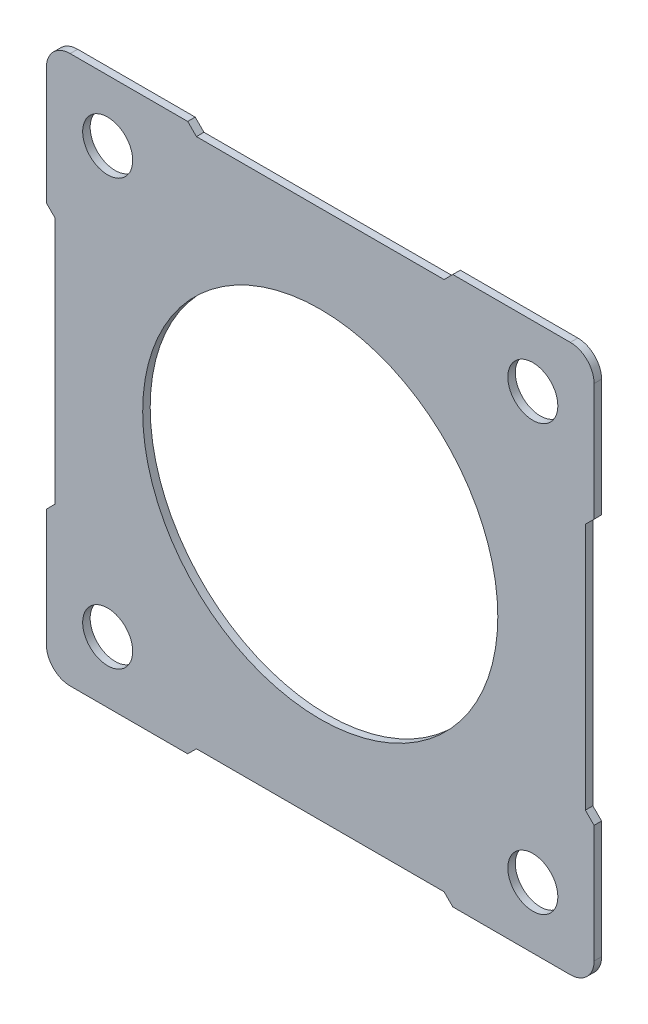
ISO-10303-21;
HEADER;
FILE_DESCRIPTION(('STEP AP214'),'2;1');
FILE_NAME('part.step','',(''),(''),'','','');
FILE_SCHEMA(('AUTOMOTIVE_DESIGN { 1 0 10303 214 1 1 1 1 }'));
ENDSEC;
DATA;
#1=APPLICATION_CONTEXT('core data for automotive mechanical design processes');
#2=APPLICATION_PROTOCOL_DEFINITION('international standard','automotive_design',2000,#1);
#3=PRODUCT_CONTEXT('',#1,'mechanical');
#4=PRODUCT('Part','Part','',(#3));
#5=PRODUCT_RELATED_PRODUCT_CATEGORY('part','',(#4));
#6=PRODUCT_DEFINITION_FORMATION('','',#4);
#7=PRODUCT_DEFINITION_CONTEXT('part definition',#1,'design');
#8=PRODUCT_DEFINITION('design','',#6,#7);
#9=PRODUCT_DEFINITION_SHAPE('','',#8);
#10=(LENGTH_UNIT() NAMED_UNIT(*) SI_UNIT(.MILLI.,.METRE.));
#11=(NAMED_UNIT(*) PLANE_ANGLE_UNIT() SI_UNIT($,.RADIAN.));
#12=(NAMED_UNIT(*) SI_UNIT($,.STERADIAN.) SOLID_ANGLE_UNIT());
#13=UNCERTAINTY_MEASURE_WITH_UNIT(LENGTH_MEASURE(1.E-05),#10,'distance_accuracy_value','');
#14=(GEOMETRIC_REPRESENTATION_CONTEXT(3) GLOBAL_UNCERTAINTY_ASSIGNED_CONTEXT((#13)) GLOBAL_UNIT_ASSIGNED_CONTEXT((#10,
#11,#12)) REPRESENTATION_CONTEXT('',''));
#15=CARTESIAN_POINT('',(0.,0.,0.));
#16=DIRECTION('',(0.,0.,1.));
#17=DIRECTION('',(1.,0.,0.));
#18=AXIS2_PLACEMENT_3D('',#15,#16,#17);
#19=CARTESIAN_POINT('',(-5.,-5.,3.5));
#20=DIRECTION('',(0.,0.,-1.));
#21=DIRECTION('',(-1.,0.,0.));
#22=AXIS2_PLACEMENT_3D('',#19,#20,#21);
#23=PLANE('',#22);
#24=DIRECTION('',(0.707106781186546,-0.707106781186549,0.));
#25=VECTOR('',#24,1.);
#26=CARTESIAN_POINT('',(-2.475,5.3,3.5));
#27=LINE('',#26,#25);
#28=CARTESIAN_POINT('',(-2.475,5.3,3.5));
#29=VERTEX_POINT('',#28);
#30=CARTESIAN_POINT('',(-2.65,5.475,3.5));
#31=VERTEX_POINT('',#30);
#32=EDGE_CURVE('E118',#29,#31,#27,.F.);
#33=ORIENTED_EDGE('',*,*,#32,.T.);
#34=DIRECTION('',(1.,0.,0.));
#35=VECTOR('',#34,1.);
#36=CARTESIAN_POINT('',(-5.,5.475,3.5));
#37=LINE('',#36,#35);
#38=CARTESIAN_POINT('',(-5.,5.475,3.5));
#39=VERTEX_POINT('',#38);
#40=EDGE_CURVE('E148',#31,#39,#37,.F.);
#41=ORIENTED_EDGE('',*,*,#40,.T.);
#42=CARTESIAN_POINT('',(-5.,5.,3.5));
#43=DIRECTION('',(0.,0.,-1.));
#44=DIRECTION('',(-1.,0.,0.));
#45=AXIS2_PLACEMENT_3D('',#42,#43,#44);
#46=CIRCLE('',#45,0.475000000000008);
#47=CARTESIAN_POINT('',(-5.475,5.,3.5));
#48=VERTEX_POINT('',#47);
#49=EDGE_CURVE('E298',#48,#39,#46,.T.);
#50=ORIENTED_EDGE('',*,*,#49,.F.);
#51=DIRECTION('',(0.,1.,0.));
#52=VECTOR('',#51,1.);
#53=CARTESIAN_POINT('',(-5.475,-5.,3.5));
#54=LINE('',#53,#52);
#55=CARTESIAN_POINT('',(-5.475,2.65,3.5));
#56=VERTEX_POINT('',#55);
#57=EDGE_CURVE('E155',#48,#56,#54,.F.);
#58=ORIENTED_EDGE('',*,*,#57,.T.);
#59=DIRECTION('',(0.707106781186548,-0.707106781186548,0.));
#60=VECTOR('',#59,1.);
#61=CARTESIAN_POINT('',(-5.3,2.475,3.49999999999999));
#62=LINE('',#61,#60);
#63=CARTESIAN_POINT('',(-5.3,2.475,3.49999999999999));
#64=VERTEX_POINT('',#63);
#65=EDGE_CURVE('E159',#64,#56,#62,.F.);
#66=ORIENTED_EDGE('',*,*,#65,.F.);
#67=DIRECTION('',(0.,-1.,0.));
#68=VECTOR('',#67,1.);
#69=CARTESIAN_POINT('',(-5.3,-2.475,3.5));
#70=LINE('',#69,#68);
#71=CARTESIAN_POINT('',(-5.3,-2.475,3.5));
#72=VERTEX_POINT('',#71);
#73=EDGE_CURVE('E167',#72,#64,#70,.F.);
#74=ORIENTED_EDGE('',*,*,#73,.F.);
#75=DIRECTION('',(-0.707106781186549,-0.707106781186546,0.));
#76=VECTOR('',#75,1.);
#77=CARTESIAN_POINT('',(-5.475,-2.65,3.5));
#78=LINE('',#77,#76);
#79=CARTESIAN_POINT('',(-5.475,-2.65,3.5));
#80=VERTEX_POINT('',#79);
#81=EDGE_CURVE('E173',#80,#72,#78,.F.);
#82=ORIENTED_EDGE('',*,*,#81,.F.);
#83=DIRECTION('',(0.,1.,0.));
#84=VECTOR('',#83,1.);
#85=CARTESIAN_POINT('',(-5.475,-5.,3.5));
#86=LINE('',#85,#84);
#87=CARTESIAN_POINT('',(-5.475,-5.,3.5));
#88=VERTEX_POINT('',#87);
#89=EDGE_CURVE('E179',#80,#88,#86,.F.);
#90=ORIENTED_EDGE('',*,*,#89,.T.);
#91=CARTESIAN_POINT('',(-5.,-5.,3.5));
#92=DIRECTION('',(0.,0.,-1.));
#93=DIRECTION('',(-1.,0.,0.));
#94=AXIS2_PLACEMENT_3D('',#91,#92,#93);
#95=CIRCLE('',#94,0.475000000000006);
#96=CARTESIAN_POINT('',(-5.,-5.475,3.5));
#97=VERTEX_POINT('',#96);
#98=EDGE_CURVE('E301',#97,#88,#95,.T.);
#99=ORIENTED_EDGE('',*,*,#98,.F.);
#100=DIRECTION('',(-1.,0.,0.));
#101=VECTOR('',#100,1.);
#102=CARTESIAN_POINT('',(5.,-5.475,3.5));
#103=LINE('',#102,#101);
#104=CARTESIAN_POINT('',(-2.65,-5.475,3.5));
#105=VERTEX_POINT('',#104);
#106=EDGE_CURVE('E185',#97,#105,#103,.F.);
#107=ORIENTED_EDGE('',*,*,#106,.T.);
#108=DIRECTION('',(0.707106781186546,0.707106781186549,0.));
#109=VECTOR('',#108,1.);
#110=CARTESIAN_POINT('',(-2.475,-5.3,3.5));
#111=LINE('',#110,#109);
#112=CARTESIAN_POINT('',(-2.475,-5.3,3.5));
#113=VERTEX_POINT('',#112);
#114=EDGE_CURVE('E189',#113,#105,#111,.F.);
#115=ORIENTED_EDGE('',*,*,#114,.F.);
#116=DIRECTION('',(1.,0.,0.));
#117=VECTOR('',#116,1.);
#118=CARTESIAN_POINT('',(2.475,-5.3,3.5));
#119=LINE('',#118,#117);
#120=CARTESIAN_POINT('',(2.475,-5.3,3.5));
#121=VERTEX_POINT('',#120);
#122=EDGE_CURVE('E197',#121,#113,#119,.F.);
#123=ORIENTED_EDGE('',*,*,#122,.F.);
#124=DIRECTION('',(0.707106781186546,-0.707106781186549,0.));
#125=VECTOR('',#124,1.);
#126=CARTESIAN_POINT('',(2.65,-5.475,3.5));
#127=LINE('',#126,#125);
#128=CARTESIAN_POINT('',(2.65,-5.475,3.5));
#129=VERTEX_POINT('',#128);
#130=EDGE_CURVE('E203',#129,#121,#127,.F.);
#131=ORIENTED_EDGE('',*,*,#130,.F.);
#132=DIRECTION('',(-1.,0.,0.));
#133=VECTOR('',#132,1.);
#134=CARTESIAN_POINT('',(5.,-5.475,3.5));
#135=LINE('',#134,#133);
#136=CARTESIAN_POINT('',(5.,-5.475,3.5));
#137=VERTEX_POINT('',#136);
#138=EDGE_CURVE('E209',#129,#137,#135,.F.);
#139=ORIENTED_EDGE('',*,*,#138,.T.);
#140=CARTESIAN_POINT('',(5.,-5.,3.5));
#141=DIRECTION('',(0.,0.,-1.));
#142=DIRECTION('',(-1.,0.,0.));
#143=AXIS2_PLACEMENT_3D('',#140,#141,#142);
#144=CIRCLE('',#143,0.475);
#145=CARTESIAN_POINT('',(5.475,-5.,3.5));
#146=VERTEX_POINT('',#145);
#147=EDGE_CURVE('E303',#146,#137,#144,.T.);
#148=ORIENTED_EDGE('',*,*,#147,.F.);
#149=DIRECTION('',(0.,-1.,0.));
#150=VECTOR('',#149,1.);
#151=CARTESIAN_POINT('',(5.475,5.,3.5));
#152=LINE('',#151,#150);
#153=CARTESIAN_POINT('',(5.475,-2.65,3.5));
#154=VERTEX_POINT('',#153);
#155=EDGE_CURVE('E215',#146,#154,#152,.F.);
#156=ORIENTED_EDGE('',*,*,#155,.T.);
#157=DIRECTION('',(0.707106781186548,-0.707106781186548,0.));
#158=VECTOR('',#157,1.);
#159=CARTESIAN_POINT('',(5.475,-2.65,3.49999999999999));
#160=LINE('',#159,#158);
#161=CARTESIAN_POINT('',(5.3,-2.475,3.49999999999999));
#162=VERTEX_POINT('',#161);
#163=EDGE_CURVE('E222',#154,#162,#160,.F.);
#164=ORIENTED_EDGE('',*,*,#163,.T.);
#165=DIRECTION('',(0.,1.,0.));
#166=VECTOR('',#165,1.);
#167=CARTESIAN_POINT('',(5.3,-2.475,3.5));
#168=LINE('',#167,#166);
#169=CARTESIAN_POINT('',(5.3,2.475,3.5));
#170=VERTEX_POINT('',#169);
#171=EDGE_CURVE('E228',#162,#170,#168,.T.);
#172=ORIENTED_EDGE('',*,*,#171,.T.);
#173=DIRECTION('',(-0.707106781186548,-0.707106781186548,0.));
#174=VECTOR('',#173,1.);
#175=CARTESIAN_POINT('',(5.3,2.475,3.49999999999999));
#176=LINE('',#175,#174);
#177=CARTESIAN_POINT('',(5.475,2.65,3.49999999999999));
#178=VERTEX_POINT('',#177);
#179=EDGE_CURVE('E234',#170,#178,#176,.F.);
#180=ORIENTED_EDGE('',*,*,#179,.T.);
#181=DIRECTION('',(0.,-1.,0.));
#182=VECTOR('',#181,1.);
#183=CARTESIAN_POINT('',(5.475,5.,3.5));
#184=LINE('',#183,#182);
#185=CARTESIAN_POINT('',(5.475,5.,3.5));
#186=VERTEX_POINT('',#185);
#187=EDGE_CURVE('E237',#178,#186,#184,.F.);
#188=ORIENTED_EDGE('',*,*,#187,.T.);
#189=CARTESIAN_POINT('',(5.,5.,3.5));
#190=DIRECTION('',(0.,0.,-1.));
#191=DIRECTION('',(-1.,0.,0.));
#192=AXIS2_PLACEMENT_3D('',#189,#190,#191);
#193=CIRCLE('',#192,0.47500000000001);
#194=CARTESIAN_POINT('',(5.,5.47500000000001,3.5));
#195=VERTEX_POINT('',#194);
#196=EDGE_CURVE('E19',#195,#186,#193,.T.);
#197=ORIENTED_EDGE('',*,*,#196,.F.);
#198=DIRECTION('',(1.,0.,0.));
#199=VECTOR('',#198,1.);
#200=CARTESIAN_POINT('',(-5.,5.475,3.5));
#201=LINE('',#200,#199);
#202=CARTESIAN_POINT('',(2.65,5.475,3.5));
#203=VERTEX_POINT('',#202);
#204=EDGE_CURVE('E99',#195,#203,#201,.F.);
#205=ORIENTED_EDGE('',*,*,#204,.T.);
#206=DIRECTION('',(0.707106781186546,0.707106781186549,0.));
#207=VECTOR('',#206,1.);
#208=CARTESIAN_POINT('',(2.65,5.475,3.5));
#209=LINE('',#208,#207);
#210=CARTESIAN_POINT('',(2.475,5.3,3.5));
#211=VERTEX_POINT('',#210);
#212=EDGE_CURVE('E120',#203,#211,#209,.F.);
#213=ORIENTED_EDGE('',*,*,#212,.T.);
#214=DIRECTION('',(1.,0.,0.));
#215=VECTOR('',#214,1.);
#216=CARTESIAN_POINT('',(2.475,5.3,3.5));
#217=LINE('',#216,#215);
#218=EDGE_CURVE('E114',#211,#29,#217,.F.);
#219=ORIENTED_EDGE('',*,*,#218,.T.);
#220=EDGE_LOOP('',(#33,#41,#50,#58,#66,#74,#82,#90,#99,#107,#115,#123,#131,#139,#148,#156,#164,
#172,#180,#188,#197,#205,#213,#219));
#221=FACE_BOUND('',#220,.T.);
#222=CARTESIAN_POINT('',(-4.25,-4.25,3.5));
#223=DIRECTION('',(0.,0.,1.));
#224=DIRECTION('',(1.,0.,0.));
#225=AXIS2_PLACEMENT_3D('',#222,#223,#224);
#226=CIRCLE('',#225,0.5);
#227=CARTESIAN_POINT('',(-3.75,-4.25,3.5));
#228=VERTEX_POINT('',#227);
#229=EDGE_CURVE('E283',#228,#228,#226,.F.);
#230=ORIENTED_EDGE('',*,*,#229,.T.);
#231=EDGE_LOOP('',(#230));
#232=FACE_BOUND('',#231,.T.);
#233=CARTESIAN_POINT('',(4.25,-4.25,3.5));
#234=DIRECTION('',(0.,0.,1.));
#235=DIRECTION('',(1.,0.,0.));
#236=AXIS2_PLACEMENT_3D('',#233,#234,#235);
#237=CIRCLE('',#236,0.5);
#238=CARTESIAN_POINT('',(4.75,-4.25,3.5));
#239=VERTEX_POINT('',#238);
#240=EDGE_CURVE('E287',#239,#239,#237,.F.);
#241=ORIENTED_EDGE('',*,*,#240,.T.);
#242=EDGE_LOOP('',(#241));
#243=FACE_BOUND('',#242,.T.);
#244=CARTESIAN_POINT('',(0.,0.,3.5));
#245=DIRECTION('',(0.,0.,1.));
#246=DIRECTION('',(1.,0.,0.));
#247=AXIS2_PLACEMENT_3D('',#244,#245,#246);
#248=CIRCLE('',#247,3.55);
#249=CARTESIAN_POINT('',(3.55,0.,3.5));
#250=VERTEX_POINT('',#249);
#251=EDGE_CURVE('E290',#250,#250,#248,.F.);
#252=ORIENTED_EDGE('',*,*,#251,.T.);
#253=EDGE_LOOP('',(#252));
#254=FACE_BOUND('',#253,.T.);
#255=CARTESIAN_POINT('',(4.25,4.25,3.5));
#256=DIRECTION('',(0.,0.,1.));
#257=DIRECTION('',(1.,0.,0.));
#258=AXIS2_PLACEMENT_3D('',#255,#256,#257);
#259=CIRCLE('',#258,0.5);
#260=CARTESIAN_POINT('',(4.75,4.25,3.5));
#261=VERTEX_POINT('',#260);
#262=EDGE_CURVE('E293',#261,#261,#259,.F.);
#263=ORIENTED_EDGE('',*,*,#262,.T.);
#264=EDGE_LOOP('',(#263));
#265=FACE_BOUND('',#264,.T.);
#266=CARTESIAN_POINT('',(-4.25,4.25,3.5));
#267=DIRECTION('',(0.,0.,1.));
#268=DIRECTION('',(1.,0.,0.));
#269=AXIS2_PLACEMENT_3D('',#266,#267,#268);
#270=CIRCLE('',#269,0.5);
#271=CARTESIAN_POINT('',(-3.75,4.25,3.5));
#272=VERTEX_POINT('',#271);
#273=EDGE_CURVE('E150',#272,#272,#270,.F.);
#274=ORIENTED_EDGE('',*,*,#273,.T.);
#275=EDGE_LOOP('',(#274));
#276=FACE_BOUND('',#275,.T.);
#277=ADVANCED_FACE('F16',(#221,#232,#243,#254,#265,#276),#23,.F.);
#278=CARTESIAN_POINT('',(-2.475,5.3,15.8762401090435));
#279=DIRECTION('',(-0.707106781186549,-0.707106781186546,0.));
#280=DIRECTION('',(0.707106781186546,-0.707106781186549,0.));
#281=AXIS2_PLACEMENT_3D('',#278,#279,#280);
#282=PLANE('',#281);
#283=DIRECTION('',(0.,0.,1.));
#284=VECTOR('',#283,1.);
#285=CARTESIAN_POINT('',(-2.65,5.475,3.35));
#286=LINE('',#285,#284);
#287=CARTESIAN_POINT('',(-2.65,5.475,3.35));
#288=VERTEX_POINT('',#287);
#289=EDGE_CURVE('E132',#288,#31,#286,.T.);
#290=ORIENTED_EDGE('',*,*,#289,.T.);
#291=ORIENTED_EDGE('',*,*,#32,.F.);
#292=DIRECTION('',(0.,0.,1.));
#293=VECTOR('',#292,1.);
#294=CARTESIAN_POINT('',(-2.475,5.3,15.8762401090435));
#295=LINE('',#294,#293);
#296=CARTESIAN_POINT('',(-2.475,5.3,3.35));
#297=VERTEX_POINT('',#296);
#298=EDGE_CURVE('E125',#29,#297,#295,.F.);
#299=ORIENTED_EDGE('',*,*,#298,.T.);
#300=DIRECTION('',(0.707106781186547,-0.707106781186547,0.));
#301=VECTOR('',#300,1.);
#302=CARTESIAN_POINT('',(-2.65,5.475,3.35));
#303=LINE('',#302,#301);
#304=EDGE_CURVE('E286',#288,#297,#303,.T.);
#305=ORIENTED_EDGE('',*,*,#304,.F.);
#306=EDGE_LOOP('',(#290,#291,#299,#305));
#307=FACE_BOUND('',#306,.T.);
#308=ADVANCED_FACE('F128',(#307),#282,.F.);
#309=CARTESIAN_POINT('',(2.475,5.3,15.8762401090435));
#310=DIRECTION('',(0.,-1.,0.));
#311=DIRECTION('',(1.,0.,0.));
#312=AXIS2_PLACEMENT_3D('',#309,#310,#311);
#313=PLANE('',#312);
#314=ORIENTED_EDGE('',*,*,#298,.F.);
#315=ORIENTED_EDGE('',*,*,#218,.F.);
#316=DIRECTION('',(0.,0.,1.));
#317=VECTOR('',#316,1.);
#318=CARTESIAN_POINT('',(2.475,5.3,15.8762401090435));
#319=LINE('',#318,#317);
#320=CARTESIAN_POINT('',(2.475,5.3,3.35));
#321=VERTEX_POINT('',#320);
#322=EDGE_CURVE('E140',#211,#321,#319,.F.);
#323=ORIENTED_EDGE('',*,*,#322,.T.);
#324=DIRECTION('',(-1.,0.,0.));
#325=VECTOR('',#324,1.);
#326=CARTESIAN_POINT('',(-5.,5.3,3.35));
#327=LINE('',#326,#325);
#328=EDGE_CURVE('E137',#297,#321,#327,.F.);
#329=ORIENTED_EDGE('',*,*,#328,.F.);
#330=EDGE_LOOP('',(#314,#315,#323,#329));
#331=FACE_BOUND('',#330,.T.);
#332=ADVANCED_FACE('F135',(#331),#313,.F.);
#333=CARTESIAN_POINT('',(2.65,5.475,15.8762401090435));
#334=DIRECTION('',(0.707106781186549,-0.707106781186546,0.));
#335=DIRECTION('',(0.707106781186546,0.707106781186549,0.));
#336=AXIS2_PLACEMENT_3D('',#333,#334,#335);
#337=PLANE('',#336);
#338=ORIENTED_EDGE('',*,*,#322,.F.);
#339=ORIENTED_EDGE('',*,*,#212,.F.);
#340=DIRECTION('',(0.,0.,1.));
#341=VECTOR('',#340,1.);
#342=CARTESIAN_POINT('',(2.65,5.475,3.35));
#343=LINE('',#342,#341);
#344=CARTESIAN_POINT('',(2.65,5.475,3.35));
#345=VERTEX_POINT('',#344);
#346=EDGE_CURVE('E245',#203,#345,#343,.F.);
#347=ORIENTED_EDGE('',*,*,#346,.T.);
#348=DIRECTION('',(0.707106781186547,0.707106781186547,0.));
#349=VECTOR('',#348,1.);
#350=CARTESIAN_POINT('',(2.475,5.3,3.35));
#351=LINE('',#350,#349);
#352=EDGE_CURVE('E355',#321,#345,#351,.T.);
#353=ORIENTED_EDGE('',*,*,#352,.F.);
#354=EDGE_LOOP('',(#338,#339,#347,#353));
#355=FACE_BOUND('',#354,.T.);
#356=ADVANCED_FACE('F610',(#355),#337,.F.);
#357=CARTESIAN_POINT('',(-5.,5.475,3.35));
#358=DIRECTION('',(0.,-1.,0.));
#359=DIRECTION('',(1.,0.,0.));
#360=AXIS2_PLACEMENT_3D('',#357,#358,#359);
#361=PLANE('',#360);
#362=ORIENTED_EDGE('',*,*,#346,.F.);
#363=ORIENTED_EDGE('',*,*,#204,.F.);
#364=DIRECTION('',(0.,0.,-1.));
#365=VECTOR('',#364,1.);
#366=CARTESIAN_POINT('',(5.,5.47500000000001,3.35));
#367=LINE('',#366,#365);
#368=CARTESIAN_POINT('',(5.,5.475,3.35));
#369=VERTEX_POINT('',#368);
#370=EDGE_CURVE('E348',#369,#195,#367,.F.);
#371=ORIENTED_EDGE('',*,*,#370,.F.);
#372=DIRECTION('',(-1.,0.,0.));
#373=VECTOR('',#372,1.);
#374=CARTESIAN_POINT('',(-5.,5.475,3.35));
#375=LINE('',#374,#373);
#376=EDGE_CURVE('E282',#345,#369,#375,.F.);
#377=ORIENTED_EDGE('',*,*,#376,.F.);
#378=EDGE_LOOP('',(#362,#363,#371,#377));
#379=FACE_BOUND('',#378,.T.);
#380=ADVANCED_FACE('F469',(#379),#361,.F.);
#381=CARTESIAN_POINT('',(5.,5.,3.35));
#382=DIRECTION('',(0.,0.,-1.));
#383=DIRECTION('',(-1.,0.,0.));
#384=AXIS2_PLACEMENT_3D('',#381,#382,#383);
#385=CYLINDRICAL_SURFACE('',#384,0.47500000000001);
#386=CARTESIAN_POINT('',(5.,5.,3.35));
#387=DIRECTION('',(0.,0.,-1.));
#388=DIRECTION('',(-1.,0.,0.));
#389=AXIS2_PLACEMENT_3D('',#386,#387,#388);
#390=CIRCLE('',#389,0.47500000000001);
#391=CARTESIAN_POINT('',(5.475,5.,3.35));
#392=VERTEX_POINT('',#391);
#393=EDGE_CURVE('E278',#369,#392,#390,.T.);
#394=ORIENTED_EDGE('',*,*,#393,.F.);
#395=ORIENTED_EDGE('',*,*,#370,.T.);
#396=ORIENTED_EDGE('',*,*,#196,.T.);
#397=DIRECTION('',(0.,0.,1.));
#398=VECTOR('',#397,1.);
#399=CARTESIAN_POINT('',(5.475,5.,3.35));
#400=LINE('',#399,#398);
#401=EDGE_CURVE('E241',#186,#392,#400,.F.);
#402=ORIENTED_EDGE('',*,*,#401,.T.);
#403=EDGE_LOOP('',(#394,#395,#396,#402));
#404=FACE_BOUND('',#403,.T.);
#405=ADVANCED_FACE('F617',(#404),#385,.T.);
#406=CARTESIAN_POINT('',(5.475,5.,3.35));
#407=DIRECTION('',(-1.,0.,0.));
#408=DIRECTION('',(0.,-1.,0.));
#409=AXIS2_PLACEMENT_3D('',#406,#407,#408);
#410=PLANE('',#409);
#411=DIRECTION('',(0.,0.,1.));
#412=VECTOR('',#411,1.);
#413=CARTESIAN_POINT('',(5.475,2.65,15.8762401090435));
#414=LINE('',#413,#412);
#415=CARTESIAN_POINT('',(5.475,2.65,3.35));
#416=VERTEX_POINT('',#415);
#417=EDGE_CURVE('E231',#178,#416,#414,.F.);
#418=ORIENTED_EDGE('',*,*,#417,.T.);
#419=DIRECTION('',(0.,1.,0.));
#420=VECTOR('',#419,1.);
#421=CARTESIAN_POINT('',(5.475,-5.,3.35));
#422=LINE('',#421,#420);
#423=EDGE_CURVE('E281',#392,#416,#422,.F.);
#424=ORIENTED_EDGE('',*,*,#423,.F.);
#425=ORIENTED_EDGE('',*,*,#401,.F.);
#426=ORIENTED_EDGE('',*,*,#187,.F.);
#427=EDGE_LOOP('',(#418,#424,#425,#426));
#428=FACE_BOUND('',#427,.T.);
#429=ADVANCED_FACE('F620',(#428),#410,.F.);
#430=CARTESIAN_POINT('',(5.3,2.475,15.8762401090435));
#431=DIRECTION('',(-0.707106781186548,0.707106781186548,0.));
#432=DIRECTION('',(-0.707106781186548,-0.707106781186548,0.));
#433=AXIS2_PLACEMENT_3D('',#430,#431,#432);
#434=PLANE('',#433);
#435=ORIENTED_EDGE('',*,*,#417,.F.);
#436=ORIENTED_EDGE('',*,*,#179,.F.);
#437=DIRECTION('',(0.,0.,1.));
#438=VECTOR('',#437,1.);
#439=CARTESIAN_POINT('',(5.3,2.475,15.8762401090435));
#440=LINE('',#439,#438);
#441=CARTESIAN_POINT('',(5.3,2.475,3.35));
#442=VERTEX_POINT('',#441);
#443=EDGE_CURVE('E225',#170,#442,#440,.F.);
#444=ORIENTED_EDGE('',*,*,#443,.T.);
#445=DIRECTION('',(-0.707106781186547,-0.707106781186547,0.));
#446=VECTOR('',#445,1.);
#447=CARTESIAN_POINT('',(5.475,2.65,3.35));
#448=LINE('',#447,#446);
#449=EDGE_CURVE('E332',#416,#442,#448,.T.);
#450=ORIENTED_EDGE('',*,*,#449,.F.);
#451=EDGE_LOOP('',(#435,#436,#444,#450));
#452=FACE_BOUND('',#451,.T.);
#453=ADVANCED_FACE('F624',(#452),#434,.F.);
#454=CARTESIAN_POINT('',(5.3,-2.475,15.8762401090435));
#455=DIRECTION('',(-1.,0.,0.));
#456=DIRECTION('',(0.,0.,1.));
#457=AXIS2_PLACEMENT_3D('',#454,#455,#456);
#458=PLANE('',#457);
#459=ORIENTED_EDGE('',*,*,#443,.F.);
#460=ORIENTED_EDGE('',*,*,#171,.F.);
#461=DIRECTION('',(0.,0.,1.));
#462=VECTOR('',#461,1.);
#463=CARTESIAN_POINT('',(5.3,-2.475,15.8762401090435));
#464=LINE('',#463,#462);
#465=CARTESIAN_POINT('',(5.3,-2.475,3.35));
#466=VERTEX_POINT('',#465);
#467=EDGE_CURVE('E219',#162,#466,#464,.F.);
#468=ORIENTED_EDGE('',*,*,#467,.T.);
#469=DIRECTION('',(0.,1.,0.));
#470=VECTOR('',#469,1.);
#471=CARTESIAN_POINT('',(5.3,-5.,3.35));
#472=LINE('',#471,#470);
#473=EDGE_CURVE('E323',#442,#466,#472,.F.);
#474=ORIENTED_EDGE('',*,*,#473,.F.);
#475=EDGE_LOOP('',(#459,#460,#468,#474));
#476=FACE_BOUND('',#475,.T.);
#477=ADVANCED_FACE('F628',(#476),#458,.F.);
#478=CARTESIAN_POINT('',(5.475,-2.65,15.8762401090435));
#479=DIRECTION('',(-0.707106781186548,-0.707106781186548,0.));
#480=DIRECTION('',(0.707106781186548,-0.707106781186548,0.));
#481=AXIS2_PLACEMENT_3D('',#478,#479,#480);
#482=PLANE('',#481);
#483=ORIENTED_EDGE('',*,*,#467,.F.);
#484=ORIENTED_EDGE('',*,*,#163,.F.);
#485=DIRECTION('',(0.,0.,1.));
#486=VECTOR('',#485,1.);
#487=CARTESIAN_POINT('',(5.475,-2.65,3.35));
#488=LINE('',#487,#486);
#489=CARTESIAN_POINT('',(5.475,-2.65,3.35));
#490=VERTEX_POINT('',#489);
#491=EDGE_CURVE('E218',#154,#490,#488,.F.);
#492=ORIENTED_EDGE('',*,*,#491,.T.);
#493=DIRECTION('',(0.707106781186547,-0.707106781186547,0.));
#494=VECTOR('',#493,1.);
#495=CARTESIAN_POINT('',(5.3,-2.475,3.35));
#496=LINE('',#495,#494);
#497=EDGE_CURVE('E320',#466,#490,#496,.T.);
#498=ORIENTED_EDGE('',*,*,#497,.F.);
#499=EDGE_LOOP('',(#483,#484,#492,#498));
#500=FACE_BOUND('',#499,.T.);
#501=ADVANCED_FACE('F632',(#500),#482,.F.);
#502=CARTESIAN_POINT('',(5.475,5.,3.35));
#503=DIRECTION('',(-1.,0.,0.));
#504=DIRECTION('',(0.,-1.,0.));
#505=AXIS2_PLACEMENT_3D('',#502,#503,#504);
#506=PLANE('',#505);
#507=ORIENTED_EDGE('',*,*,#491,.F.);
#508=ORIENTED_EDGE('',*,*,#155,.F.);
#509=DIRECTION('',(0.,0.,-1.));
#510=VECTOR('',#509,1.);
#511=CARTESIAN_POINT('',(5.475,-5.,3.35));
#512=LINE('',#511,#510);
#513=CARTESIAN_POINT('',(5.475,-5.,3.35));
#514=VERTEX_POINT('',#513);
#515=EDGE_CURVE('E212',#514,#146,#512,.F.);
#516=ORIENTED_EDGE('',*,*,#515,.F.);
#517=DIRECTION('',(0.,1.,0.));
#518=VECTOR('',#517,1.);
#519=CARTESIAN_POINT('',(5.475,-5.,3.35));
#520=LINE('',#519,#518);
#521=EDGE_CURVE('E277',#490,#514,#520,.F.);
#522=ORIENTED_EDGE('',*,*,#521,.F.);
#523=EDGE_LOOP('',(#507,#508,#516,#522));
#524=FACE_BOUND('',#523,.T.);
#525=ADVANCED_FACE('F636',(#524),#506,.F.);
#526=CARTESIAN_POINT('',(5.,-5.,3.35));
#527=DIRECTION('',(0.,0.,-1.));
#528=DIRECTION('',(-1.,0.,0.));
#529=AXIS2_PLACEMENT_3D('',#526,#527,#528);
#530=CYLINDRICAL_SURFACE('',#529,0.475);
#531=CARTESIAN_POINT('',(5.,-5.,3.35));
#532=DIRECTION('',(0.,0.,-1.));
#533=DIRECTION('',(-1.,0.,0.));
#534=AXIS2_PLACEMENT_3D('',#531,#532,#533);
#535=CIRCLE('',#534,0.475);
#536=CARTESIAN_POINT('',(5.,-5.475,3.35));
#537=VERTEX_POINT('',#536);
#538=EDGE_CURVE('E273',#514,#537,#535,.T.);
#539=ORIENTED_EDGE('',*,*,#538,.F.);
#540=ORIENTED_EDGE('',*,*,#515,.T.);
#541=ORIENTED_EDGE('',*,*,#147,.T.);
#542=DIRECTION('',(0.,0.,1.));
#543=VECTOR('',#542,1.);
#544=CARTESIAN_POINT('',(5.,-5.475,3.35));
#545=LINE('',#544,#543);
#546=EDGE_CURVE('E211',#137,#537,#545,.F.);
#547=ORIENTED_EDGE('',*,*,#546,.T.);
#548=EDGE_LOOP('',(#539,#540,#541,#547));
#549=FACE_BOUND('',#548,.T.);
#550=ADVANCED_FACE('F439',(#549),#530,.T.);
#551=CARTESIAN_POINT('',(5.,-5.475,3.35));
#552=DIRECTION('',(0.,1.,0.));
#553=DIRECTION('',(-1.,0.,0.));
#554=AXIS2_PLACEMENT_3D('',#551,#552,#553);
#555=PLANE('',#554);
#556=DIRECTION('',(-1.,0.,0.));
#557=VECTOR('',#556,1.);
#558=CARTESIAN_POINT('',(-5.,-5.475,3.35));
#559=LINE('',#558,#557);
#560=CARTESIAN_POINT('',(2.65,-5.475,3.35));
#561=VERTEX_POINT('',#560);
#562=EDGE_CURVE('E276',#537,#561,#559,.T.);
#563=ORIENTED_EDGE('',*,*,#562,.F.);
#564=ORIENTED_EDGE('',*,*,#546,.F.);
#565=ORIENTED_EDGE('',*,*,#138,.F.);
#566=DIRECTION('',(0.,0.,1.));
#567=VECTOR('',#566,1.);
#568=CARTESIAN_POINT('',(2.65,-5.475,15.8762401090435));
#569=LINE('',#568,#567);
#570=EDGE_CURVE('E206',#561,#129,#569,.T.);
#571=ORIENTED_EDGE('',*,*,#570,.F.);
#572=EDGE_LOOP('',(#563,#564,#565,#571));
#573=FACE_BOUND('',#572,.T.);
#574=ADVANCED_FACE('F445',(#573),#555,.F.);
#575=CARTESIAN_POINT('',(2.65,-5.475,15.8762401090435));
#576=DIRECTION('',(-0.707106781186549,-0.707106781186546,0.));
#577=DIRECTION('',(0.707106781186546,-0.707106781186549,0.));
#578=AXIS2_PLACEMENT_3D('',#575,#576,#577);
#579=PLANE('',#578);
#580=DIRECTION('',(0.,0.,1.));
#581=VECTOR('',#580,1.);
#582=CARTESIAN_POINT('',(2.475,-5.3,15.8762401090435));
#583=LINE('',#582,#581);
#584=CARTESIAN_POINT('',(2.475,-5.3,3.35));
#585=VERTEX_POINT('',#584);
#586=EDGE_CURVE('E200',#585,#121,#583,.T.);
#587=ORIENTED_EDGE('',*,*,#586,.F.);
#588=DIRECTION('',(-0.707106781186547,0.707106781186547,0.));
#589=VECTOR('',#588,1.);
#590=CARTESIAN_POINT('',(2.65,-5.475,3.35));
#591=LINE('',#590,#589);
#592=EDGE_CURVE('E423',#561,#585,#591,.T.);
#593=ORIENTED_EDGE('',*,*,#592,.F.);
#594=ORIENTED_EDGE('',*,*,#570,.T.);
#595=ORIENTED_EDGE('',*,*,#130,.T.);
#596=EDGE_LOOP('',(#587,#593,#594,#595));
#597=FACE_BOUND('',#596,.T.);
#598=ADVANCED_FACE('F643',(#597),#579,.T.);
#599=CARTESIAN_POINT('',(2.475,-5.3,15.8762401090435));
#600=DIRECTION('',(0.,-1.,0.));
#601=DIRECTION('',(1.,0.,0.));
#602=AXIS2_PLACEMENT_3D('',#599,#600,#601);
#603=PLANE('',#602);
#604=DIRECTION('',(0.,0.,1.));
#605=VECTOR('',#604,1.);
#606=CARTESIAN_POINT('',(-2.475,-5.3,15.8762401090435));
#607=LINE('',#606,#605);
#608=CARTESIAN_POINT('',(-2.475,-5.3,3.35));
#609=VERTEX_POINT('',#608);
#610=EDGE_CURVE('E194',#609,#113,#607,.T.);
#611=ORIENTED_EDGE('',*,*,#610,.F.);
#612=DIRECTION('',(-1.,0.,0.));
#613=VECTOR('',#612,1.);
#614=CARTESIAN_POINT('',(-5.,-5.3,3.35));
#615=LINE('',#614,#613);
#616=EDGE_CURVE('E414',#585,#609,#615,.T.);
#617=ORIENTED_EDGE('',*,*,#616,.F.);
#618=ORIENTED_EDGE('',*,*,#586,.T.);
#619=ORIENTED_EDGE('',*,*,#122,.T.);
#620=EDGE_LOOP('',(#611,#617,#618,#619));
#621=FACE_BOUND('',#620,.T.);
#622=ADVANCED_FACE('F646',(#621),#603,.T.);
#623=CARTESIAN_POINT('',(-2.475,-5.3,15.8762401090435));
#624=DIRECTION('',(0.707106781186549,-0.707106781186546,0.));
#625=DIRECTION('',(0.707106781186546,0.707106781186549,0.));
#626=AXIS2_PLACEMENT_3D('',#623,#624,#625);
#627=PLANE('',#626);
#628=DIRECTION('',(0.,0.,1.));
#629=VECTOR('',#628,1.);
#630=CARTESIAN_POINT('',(-2.65,-5.475,3.35));
#631=LINE('',#630,#629);
#632=CARTESIAN_POINT('',(-2.65,-5.475,3.35));
#633=VERTEX_POINT('',#632);
#634=EDGE_CURVE('E188',#105,#633,#631,.F.);
#635=ORIENTED_EDGE('',*,*,#634,.T.);
#636=DIRECTION('',(-0.707106781186547,-0.707106781186547,0.));
#637=VECTOR('',#636,1.);
#638=CARTESIAN_POINT('',(-2.475,-5.3,3.35));
#639=LINE('',#638,#637);
#640=EDGE_CURVE('E411',#609,#633,#639,.T.);
#641=ORIENTED_EDGE('',*,*,#640,.F.);
#642=ORIENTED_EDGE('',*,*,#610,.T.);
#643=ORIENTED_EDGE('',*,*,#114,.T.);
#644=EDGE_LOOP('',(#635,#641,#642,#643));
#645=FACE_BOUND('',#644,.T.);
#646=ADVANCED_FACE('F650',(#645),#627,.T.);
#647=CARTESIAN_POINT('',(5.,-5.475,3.35));
#648=DIRECTION('',(0.,1.,0.));
#649=DIRECTION('',(-1.,0.,0.));
#650=AXIS2_PLACEMENT_3D('',#647,#648,#649);
#651=PLANE('',#650);
#652=ORIENTED_EDGE('',*,*,#106,.F.);
#653=DIRECTION('',(0.,0.,-1.));
#654=VECTOR('',#653,1.);
#655=CARTESIAN_POINT('',(-5.,-5.47500000000001,3.35));
#656=LINE('',#655,#654);
#657=CARTESIAN_POINT('',(-5.,-5.475,3.35));
#658=VERTEX_POINT('',#657);
#659=EDGE_CURVE('E182',#658,#97,#656,.F.);
#660=ORIENTED_EDGE('',*,*,#659,.F.);
#661=DIRECTION('',(-1.,0.,0.));
#662=VECTOR('',#661,1.);
#663=CARTESIAN_POINT('',(-5.,-5.475,3.35));
#664=LINE('',#663,#662);
#665=EDGE_CURVE('E272',#633,#658,#664,.T.);
#666=ORIENTED_EDGE('',*,*,#665,.F.);
#667=ORIENTED_EDGE('',*,*,#634,.F.);
#668=EDGE_LOOP('',(#652,#660,#666,#667));
#669=FACE_BOUND('',#668,.T.);
#670=ADVANCED_FACE('F537',(#669),#651,.F.);
#671=CARTESIAN_POINT('',(-5.,-5.,3.35));
#672=DIRECTION('',(0.,0.,-1.));
#673=DIRECTION('',(-1.,0.,0.));
#674=AXIS2_PLACEMENT_3D('',#671,#672,#673);
#675=CYLINDRICAL_SURFACE('',#674,0.475000000000006);
#676=CARTESIAN_POINT('',(-5.,-5.,3.35));
#677=DIRECTION('',(0.,0.,-1.));
#678=DIRECTION('',(-1.,0.,0.));
#679=AXIS2_PLACEMENT_3D('',#676,#677,#678);
#680=CIRCLE('',#679,0.475000000000006);
#681=CARTESIAN_POINT('',(-5.475,-5.,3.35));
#682=VERTEX_POINT('',#681);
#683=EDGE_CURVE('E268',#658,#682,#680,.T.);
#684=ORIENTED_EDGE('',*,*,#683,.F.);
#685=ORIENTED_EDGE('',*,*,#659,.T.);
#686=ORIENTED_EDGE('',*,*,#98,.T.);
#687=DIRECTION('',(0.,0.,-1.));
#688=VECTOR('',#687,1.);
#689=CARTESIAN_POINT('',(-5.475,-5.,3.35));
#690=LINE('',#689,#688);
#691=EDGE_CURVE('E181',#88,#682,#690,.T.);
#692=ORIENTED_EDGE('',*,*,#691,.T.);
#693=EDGE_LOOP('',(#684,#685,#686,#692));
#694=FACE_BOUND('',#693,.T.);
#695=ADVANCED_FACE('F539',(#694),#675,.T.);
#696=CARTESIAN_POINT('',(-5.475,-5.,3.35));
#697=DIRECTION('',(1.,0.,0.));
#698=DIRECTION('',(0.,0.,-1.));
#699=AXIS2_PLACEMENT_3D('',#696,#697,#698);
#700=PLANE('',#699);
#701=DIRECTION('',(0.,1.,0.));
#702=VECTOR('',#701,1.);
#703=CARTESIAN_POINT('',(-5.475,-5.,3.35));
#704=LINE('',#703,#702);
#705=CARTESIAN_POINT('',(-5.475,-2.65,3.35));
#706=VERTEX_POINT('',#705);
#707=EDGE_CURVE('E271',#682,#706,#704,.T.);
#708=ORIENTED_EDGE('',*,*,#707,.F.);
#709=ORIENTED_EDGE('',*,*,#691,.F.);
#710=ORIENTED_EDGE('',*,*,#89,.F.);
#711=DIRECTION('',(0.,0.,1.));
#712=VECTOR('',#711,1.);
#713=CARTESIAN_POINT('',(-5.475,-2.65,15.8762401090435));
#714=LINE('',#713,#712);
#715=EDGE_CURVE('E176',#706,#80,#714,.T.);
#716=ORIENTED_EDGE('',*,*,#715,.F.);
#717=EDGE_LOOP('',(#708,#709,#710,#716));
#718=FACE_BOUND('',#717,.T.);
#719=ADVANCED_FACE('F543',(#718),#700,.F.);
#720=CARTESIAN_POINT('',(-5.475,-2.65,15.8762401090435));
#721=DIRECTION('',(-0.707106781186546,0.707106781186549,0.));
#722=DIRECTION('',(-0.707106781186549,-0.707106781186546,0.));
#723=AXIS2_PLACEMENT_3D('',#720,#721,#722);
#724=PLANE('',#723);
#725=DIRECTION('',(0.,0.,1.));
#726=VECTOR('',#725,1.);
#727=CARTESIAN_POINT('',(-5.3,-2.475,15.8762401090435));
#728=LINE('',#727,#726);
#729=CARTESIAN_POINT('',(-5.3,-2.475,3.35));
#730=VERTEX_POINT('',#729);
#731=EDGE_CURVE('E170',#730,#72,#728,.T.);
#732=ORIENTED_EDGE('',*,*,#731,.F.);
#733=DIRECTION('',(0.707106781186547,0.707106781186547,0.));
#734=VECTOR('',#733,1.);
#735=CARTESIAN_POINT('',(-5.475,-2.65,3.35));
#736=LINE('',#735,#734);
#737=EDGE_CURVE('E389',#706,#730,#736,.T.);
#738=ORIENTED_EDGE('',*,*,#737,.F.);
#739=ORIENTED_EDGE('',*,*,#715,.T.);
#740=ORIENTED_EDGE('',*,*,#81,.T.);
#741=EDGE_LOOP('',(#732,#738,#739,#740));
#742=FACE_BOUND('',#741,.T.);
#743=ADVANCED_FACE('F547',(#742),#724,.T.);
#744=CARTESIAN_POINT('',(-5.3,-2.475,15.8762401090435));
#745=DIRECTION('',(-1.,0.,0.));
#746=DIRECTION('',(0.,-1.,0.));
#747=AXIS2_PLACEMENT_3D('',#744,#745,#746);
#748=PLANE('',#747);
#749=DIRECTION('',(0.,0.,1.));
#750=VECTOR('',#749,1.);
#751=CARTESIAN_POINT('',(-5.3,2.475,15.8762401090435));
#752=LINE('',#751,#750);
#753=CARTESIAN_POINT('',(-5.3,2.475,3.35));
#754=VERTEX_POINT('',#753);
#755=EDGE_CURVE('E164',#754,#64,#752,.T.);
#756=ORIENTED_EDGE('',*,*,#755,.F.);
#757=DIRECTION('',(0.,1.,0.));
#758=VECTOR('',#757,1.);
#759=CARTESIAN_POINT('',(-5.3,-5.,3.35));
#760=LINE('',#759,#758);
#761=EDGE_CURVE('E380',#730,#754,#760,.T.);
#762=ORIENTED_EDGE('',*,*,#761,.F.);
#763=ORIENTED_EDGE('',*,*,#731,.T.);
#764=ORIENTED_EDGE('',*,*,#73,.T.);
#765=EDGE_LOOP('',(#756,#762,#763,#764));
#766=FACE_BOUND('',#765,.T.);
#767=ADVANCED_FACE('F551',(#766),#748,.T.);
#768=CARTESIAN_POINT('',(-5.3,2.475,15.8762401090435));
#769=DIRECTION('',(-0.707106781186548,-0.707106781186548,0.));
#770=DIRECTION('',(0.707106781186548,-0.707106781186548,0.));
#771=AXIS2_PLACEMENT_3D('',#768,#769,#770);
#772=PLANE('',#771);
#773=DIRECTION('',(0.,0.,-1.));
#774=VECTOR('',#773,1.);
#775=CARTESIAN_POINT('',(-5.475,2.65,3.35));
#776=LINE('',#775,#774);
#777=CARTESIAN_POINT('',(-5.475,2.65,3.35));
#778=VERTEX_POINT('',#777);
#779=EDGE_CURVE('E158',#56,#778,#776,.T.);
#780=ORIENTED_EDGE('',*,*,#779,.T.);
#781=DIRECTION('',(-0.707106781186547,0.707106781186547,0.));
#782=VECTOR('',#781,1.);
#783=CARTESIAN_POINT('',(-5.3,2.475,3.35));
#784=LINE('',#783,#782);
#785=EDGE_CURVE('E377',#754,#778,#784,.T.);
#786=ORIENTED_EDGE('',*,*,#785,.F.);
#787=ORIENTED_EDGE('',*,*,#755,.T.);
#788=ORIENTED_EDGE('',*,*,#65,.T.);
#789=EDGE_LOOP('',(#780,#786,#787,#788));
#790=FACE_BOUND('',#789,.T.);
#791=ADVANCED_FACE('F555',(#790),#772,.T.);
#792=CARTESIAN_POINT('',(-5.475,-5.,3.35));
#793=DIRECTION('',(1.,0.,0.));
#794=DIRECTION('',(0.,0.,-1.));
#795=AXIS2_PLACEMENT_3D('',#792,#793,#794);
#796=PLANE('',#795);
#797=ORIENTED_EDGE('',*,*,#57,.F.);
#798=DIRECTION('',(0.,0.,-1.));
#799=VECTOR('',#798,1.);
#800=CARTESIAN_POINT('',(-5.47500000000001,5.,3.35));
#801=LINE('',#800,#799);
#802=CARTESIAN_POINT('',(-5.475,5.,3.35));
#803=VERTEX_POINT('',#802);
#804=EDGE_CURVE('E300',#803,#48,#801,.F.);
#805=ORIENTED_EDGE('',*,*,#804,.F.);
#806=DIRECTION('',(0.,1.,0.));
#807=VECTOR('',#806,1.);
#808=CARTESIAN_POINT('',(-5.475,-5.,3.35));
#809=LINE('',#808,#807);
#810=EDGE_CURVE('E267',#778,#803,#809,.T.);
#811=ORIENTED_EDGE('',*,*,#810,.F.);
#812=ORIENTED_EDGE('',*,*,#779,.F.);
#813=EDGE_LOOP('',(#797,#805,#811,#812));
#814=FACE_BOUND('',#813,.T.);
#815=ADVANCED_FACE('F560',(#814),#796,.F.);
#816=CARTESIAN_POINT('',(-5.,5.,3.35));
#817=DIRECTION('',(0.,0.,-1.));
#818=DIRECTION('',(-1.,0.,0.));
#819=AXIS2_PLACEMENT_3D('',#816,#817,#818);
#820=CYLINDRICAL_SURFACE('',#819,0.475000000000008);
#821=CARTESIAN_POINT('',(-5.,5.,3.35));
#822=DIRECTION('',(0.,0.,-1.));
#823=DIRECTION('',(-1.,0.,0.));
#824=AXIS2_PLACEMENT_3D('',#821,#822,#823);
#825=CIRCLE('',#824,0.475000000000008);
#826=CARTESIAN_POINT('',(-5.,5.475,3.35));
#827=VERTEX_POINT('',#826);
#828=EDGE_CURVE('E264',#803,#827,#825,.T.);
#829=ORIENTED_EDGE('',*,*,#828,.F.);
#830=ORIENTED_EDGE('',*,*,#804,.T.);
#831=ORIENTED_EDGE('',*,*,#49,.T.);
#832=DIRECTION('',(0.,0.,1.));
#833=VECTOR('',#832,1.);
#834=CARTESIAN_POINT('',(-5.,5.475,3.35));
#835=LINE('',#834,#833);
#836=EDGE_CURVE('E34',#39,#827,#835,.F.);
#837=ORIENTED_EDGE('',*,*,#836,.T.);
#838=EDGE_LOOP('',(#829,#830,#831,#837));
#839=FACE_BOUND('',#838,.T.);
#840=ADVANCED_FACE('F561',(#839),#820,.T.);
#841=CARTESIAN_POINT('',(-5.,5.475,3.35));
#842=DIRECTION('',(0.,-1.,0.));
#843=DIRECTION('',(1.,0.,0.));
#844=AXIS2_PLACEMENT_3D('',#841,#842,#843);
#845=PLANE('',#844);
#846=ORIENTED_EDGE('',*,*,#289,.F.);
#847=DIRECTION('',(-1.,0.,0.));
#848=VECTOR('',#847,1.);
#849=CARTESIAN_POINT('',(-5.,5.475,3.35));
#850=LINE('',#849,#848);
#851=EDGE_CURVE('E263',#827,#288,#850,.F.);
#852=ORIENTED_EDGE('',*,*,#851,.F.);
#853=ORIENTED_EDGE('',*,*,#836,.F.);
#854=ORIENTED_EDGE('',*,*,#40,.F.);
#855=EDGE_LOOP('',(#846,#852,#853,#854));
#856=FACE_BOUND('',#855,.T.);
#857=ADVANCED_FACE('F515',(#856),#845,.F.);
#858=CARTESIAN_POINT('',(-4.25,4.25,15.8762401090435));
#859=DIRECTION('',(0.,0.,1.));
#860=DIRECTION('',(1.,0.,0.));
#861=AXIS2_PLACEMENT_3D('',#858,#859,#860);
#862=CYLINDRICAL_SURFACE('',#861,0.5);
#863=CARTESIAN_POINT('',(-4.25,4.25,3.35));
#864=DIRECTION('',(0.,0.,1.));
#865=DIRECTION('',(1.,0.,0.));
#866=AXIS2_PLACEMENT_3D('',#863,#864,#865);
#867=CIRCLE('',#866,0.5);
#868=CARTESIAN_POINT('',(-3.75,4.25,3.35));
#869=VERTEX_POINT('',#868);
#870=EDGE_CURVE('E260',#869,#869,#867,.T.);
#871=ORIENTED_EDGE('',*,*,#870,.F.);
#872=EDGE_LOOP('',(#871));
#873=FACE_BOUND('',#872,.T.);
#874=ORIENTED_EDGE('',*,*,#273,.F.);
#875=EDGE_LOOP('',(#874));
#876=FACE_BOUND('',#875,.T.);
#877=ADVANCED_FACE('F569',(#873,#876),#862,.F.);
#878=CARTESIAN_POINT('',(4.25,4.25,15.8762401090435));
#879=DIRECTION('',(0.,0.,1.));
#880=DIRECTION('',(1.,0.,0.));
#881=AXIS2_PLACEMENT_3D('',#878,#879,#880);
#882=CYLINDRICAL_SURFACE('',#881,0.5);
#883=CARTESIAN_POINT('',(4.25,4.25,3.35));
#884=DIRECTION('',(0.,0.,1.));
#885=DIRECTION('',(1.,0.,0.));
#886=AXIS2_PLACEMENT_3D('',#883,#884,#885);
#887=CIRCLE('',#886,0.5);
#888=CARTESIAN_POINT('',(4.75,4.25,3.35));
#889=VERTEX_POINT('',#888);
#890=EDGE_CURVE('E257',#889,#889,#887,.T.);
#891=ORIENTED_EDGE('',*,*,#890,.F.);
#892=EDGE_LOOP('',(#891));
#893=FACE_BOUND('',#892,.T.);
#894=ORIENTED_EDGE('',*,*,#262,.F.);
#895=EDGE_LOOP('',(#894));
#896=FACE_BOUND('',#895,.T.);
#897=ADVANCED_FACE('F590',(#893,#896),#882,.F.);
#898=CARTESIAN_POINT('',(0.,0.,15.8762401090435));
#899=DIRECTION('',(0.,0.,1.));
#900=DIRECTION('',(1.,0.,0.));
#901=AXIS2_PLACEMENT_3D('',#898,#899,#900);
#902=CYLINDRICAL_SURFACE('',#901,3.55);
#903=CARTESIAN_POINT('',(0.,0.,3.35));
#904=DIRECTION('',(0.,0.,1.));
#905=DIRECTION('',(1.,0.,0.));
#906=AXIS2_PLACEMENT_3D('',#903,#904,#905);
#907=CIRCLE('',#906,3.55);
#908=CARTESIAN_POINT('',(3.55,0.,3.35));
#909=VERTEX_POINT('',#908);
#910=EDGE_CURVE('E254',#909,#909,#907,.T.);
#911=ORIENTED_EDGE('',*,*,#910,.F.);
#912=EDGE_LOOP('',(#911));
#913=FACE_BOUND('',#912,.T.);
#914=ORIENTED_EDGE('',*,*,#251,.F.);
#915=EDGE_LOOP('',(#914));
#916=FACE_BOUND('',#915,.T.);
#917=ADVANCED_FACE('F586',(#913,#916),#902,.F.);
#918=CARTESIAN_POINT('',(4.25,-4.25,15.8762401090435));
#919=DIRECTION('',(0.,0.,1.));
#920=DIRECTION('',(1.,0.,0.));
#921=AXIS2_PLACEMENT_3D('',#918,#919,#920);
#922=CYLINDRICAL_SURFACE('',#921,0.5);
#923=CARTESIAN_POINT('',(4.25,-4.25,3.35));
#924=DIRECTION('',(0.,0.,1.));
#925=DIRECTION('',(1.,0.,0.));
#926=AXIS2_PLACEMENT_3D('',#923,#924,#925);
#927=CIRCLE('',#926,0.5);
#928=CARTESIAN_POINT('',(4.75,-4.25,3.35));
#929=VERTEX_POINT('',#928);
#930=EDGE_CURVE('E25',#929,#929,#927,.T.);
#931=ORIENTED_EDGE('',*,*,#930,.F.);
#932=EDGE_LOOP('',(#931));
#933=FACE_BOUND('',#932,.T.);
#934=ORIENTED_EDGE('',*,*,#240,.F.);
#935=EDGE_LOOP('',(#934));
#936=FACE_BOUND('',#935,.T.);
#937=ADVANCED_FACE('F579',(#933,#936),#922,.F.);
#938=CARTESIAN_POINT('',(-4.25,-4.25,15.8762401090435));
#939=DIRECTION('',(0.,0.,1.));
#940=DIRECTION('',(1.,0.,0.));
#941=AXIS2_PLACEMENT_3D('',#938,#939,#940);
#942=CYLINDRICAL_SURFACE('',#941,0.5);
#943=CARTESIAN_POINT('',(-4.25,-4.25,3.35));
#944=DIRECTION('',(0.,0.,1.));
#945=DIRECTION('',(1.,0.,0.));
#946=AXIS2_PLACEMENT_3D('',#943,#944,#945);
#947=CIRCLE('',#946,0.5);
#948=CARTESIAN_POINT('',(-3.75,-4.25,3.35));
#949=VERTEX_POINT('',#948);
#950=EDGE_CURVE('E11',#949,#949,#947,.T.);
#951=ORIENTED_EDGE('',*,*,#950,.F.);
#952=EDGE_LOOP('',(#951));
#953=FACE_BOUND('',#952,.T.);
#954=ORIENTED_EDGE('',*,*,#229,.F.);
#955=EDGE_LOOP('',(#954));
#956=FACE_BOUND('',#955,.T.);
#957=ADVANCED_FACE('F573',(#953,#956),#942,.F.);
#958=CARTESIAN_POINT('',(-5.,-5.,3.35));
#959=DIRECTION('',(0.,0.,-1.));
#960=DIRECTION('',(-1.,0.,0.));
#961=AXIS2_PLACEMENT_3D('',#958,#959,#960);
#962=PLANE('',#961);
#963=ORIENTED_EDGE('',*,*,#950,.T.);
#964=EDGE_LOOP('',(#963));
#965=FACE_BOUND('',#964,.T.);
#966=ORIENTED_EDGE('',*,*,#930,.T.);
#967=EDGE_LOOP('',(#966));
#968=FACE_BOUND('',#967,.T.);
#969=ORIENTED_EDGE('',*,*,#910,.T.);
#970=EDGE_LOOP('',(#969));
#971=FACE_BOUND('',#970,.T.);
#972=ORIENTED_EDGE('',*,*,#890,.T.);
#973=EDGE_LOOP('',(#972));
#974=FACE_BOUND('',#973,.T.);
#975=ORIENTED_EDGE('',*,*,#870,.T.);
#976=EDGE_LOOP('',(#975));
#977=FACE_BOUND('',#976,.T.);
#978=ORIENTED_EDGE('',*,*,#828,.T.);
#979=ORIENTED_EDGE('',*,*,#851,.T.);
#980=ORIENTED_EDGE('',*,*,#304,.T.);
#981=ORIENTED_EDGE('',*,*,#328,.T.);
#982=ORIENTED_EDGE('',*,*,#352,.T.);
#983=ORIENTED_EDGE('',*,*,#376,.T.);
#984=ORIENTED_EDGE('',*,*,#393,.T.);
#985=ORIENTED_EDGE('',*,*,#423,.T.);
#986=ORIENTED_EDGE('',*,*,#449,.T.);
#987=ORIENTED_EDGE('',*,*,#473,.T.);
#988=ORIENTED_EDGE('',*,*,#497,.T.);
#989=ORIENTED_EDGE('',*,*,#521,.T.);
#990=ORIENTED_EDGE('',*,*,#538,.T.);
#991=ORIENTED_EDGE('',*,*,#562,.T.);
#992=ORIENTED_EDGE('',*,*,#592,.T.);
#993=ORIENTED_EDGE('',*,*,#616,.T.);
#994=ORIENTED_EDGE('',*,*,#640,.T.);
#995=ORIENTED_EDGE('',*,*,#665,.T.);
#996=ORIENTED_EDGE('',*,*,#683,.T.);
#997=ORIENTED_EDGE('',*,*,#707,.T.);
#998=ORIENTED_EDGE('',*,*,#737,.T.);
#999=ORIENTED_EDGE('',*,*,#761,.T.);
#1000=ORIENTED_EDGE('',*,*,#785,.T.);
#1001=ORIENTED_EDGE('',*,*,#810,.T.);
#1002=EDGE_LOOP('',(#978,#979,#980,#981,#982,#983,#984,#985,#986,#987,#988,#989,#990,#991,#992,
#993,#994,#995,#996,#997,#998,#999,#1000,#1001));
#1003=FACE_BOUND('',#1002,.T.);
#1004=ADVANCED_FACE('F448',(#965,#968,#971,#974,#977,#1003),#962,.T.);
#1005=CLOSED_SHELL('',(#277,#308,#332,#356,#380,#405,#429,#453,#477,#501,#525,#550,#574,#598,
#622,#646,#670,#695,#719,#743,#767,#791,#815,#840,#857,#877,#897,#917,#937,#957,#1004));
#1006=MANIFOLD_SOLID_BREP('B1',#1005);
#1007=ADVANCED_BREP_SHAPE_REPRESENTATION('',(#18,#1006),#14);
#1008=SHAPE_DEFINITION_REPRESENTATION(#9,#1007);
ENDSEC;
END-ISO-10303-21;
